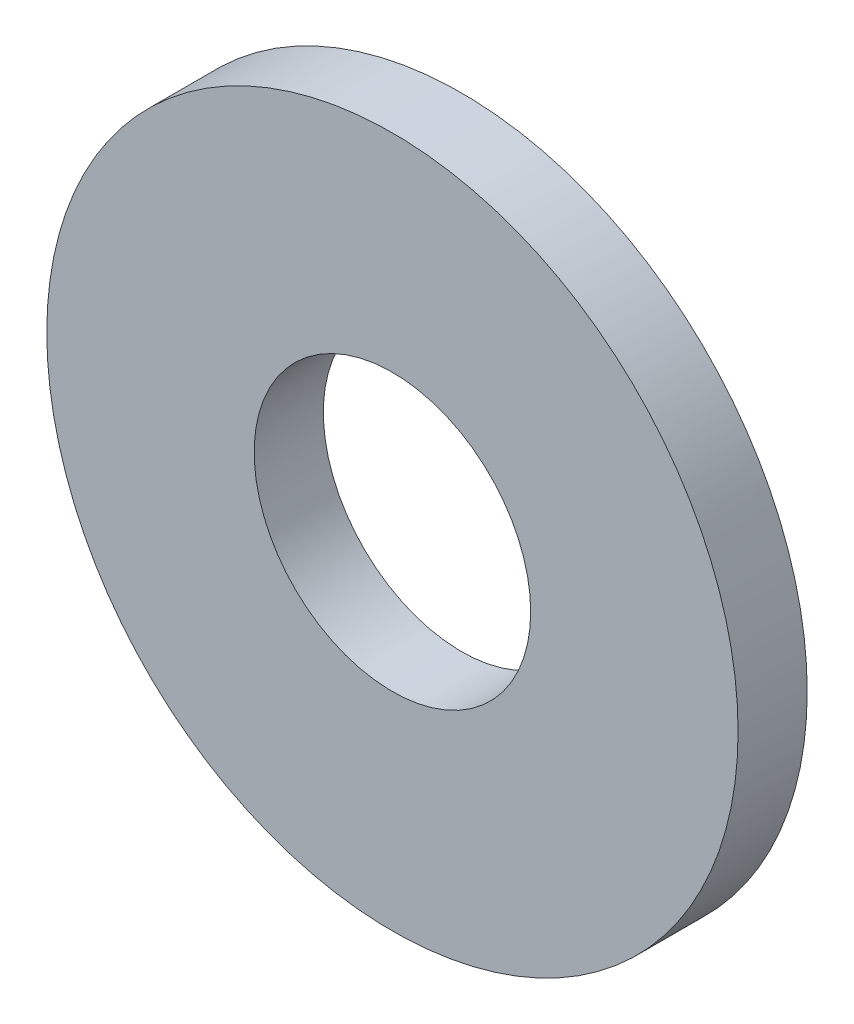
ISO-10303-21;
HEADER;
FILE_DESCRIPTION(('STEP AP214'),'2;1');
FILE_NAME('part.step','',(''),(''),'','','');
FILE_SCHEMA(('AUTOMOTIVE_DESIGN { 1 0 10303 214 1 1 1 1 }'));
ENDSEC;
DATA;
#1=APPLICATION_CONTEXT('core data for automotive mechanical design processes');
#2=APPLICATION_PROTOCOL_DEFINITION('international standard','automotive_design',2000,#1);
#3=PRODUCT_CONTEXT('',#1,'mechanical');
#4=PRODUCT('Part','Part','',(#3));
#5=PRODUCT_RELATED_PRODUCT_CATEGORY('part','',(#4));
#6=PRODUCT_DEFINITION_FORMATION('','',#4);
#7=PRODUCT_DEFINITION_CONTEXT('part definition',#1,'design');
#8=PRODUCT_DEFINITION('design','',#6,#7);
#9=PRODUCT_DEFINITION_SHAPE('','',#8);
#10=(LENGTH_UNIT() NAMED_UNIT(*) SI_UNIT(.MILLI.,.METRE.));
#11=(NAMED_UNIT(*) PLANE_ANGLE_UNIT() SI_UNIT($,.RADIAN.));
#12=(NAMED_UNIT(*) SI_UNIT($,.STERADIAN.) SOLID_ANGLE_UNIT());
#13=UNCERTAINTY_MEASURE_WITH_UNIT(LENGTH_MEASURE(1.E-05),#10,'distance_accuracy_value','');
#14=(GEOMETRIC_REPRESENTATION_CONTEXT(3) GLOBAL_UNCERTAINTY_ASSIGNED_CONTEXT((#13)) GLOBAL_UNIT_ASSIGNED_CONTEXT((#10,
#11,#12)) REPRESENTATION_CONTEXT('',''));
#15=CARTESIAN_POINT('',(0.,0.,0.));
#16=DIRECTION('',(0.,0.,1.));
#17=DIRECTION('',(1.,0.,0.));
#18=AXIS2_PLACEMENT_3D('',#15,#16,#17);
#19=CARTESIAN_POINT('',(0.,0.,0.79375));
#20=DIRECTION('',(0.,0.,1.));
#21=DIRECTION('',(1.,0.,0.));
#22=AXIS2_PLACEMENT_3D('',#19,#20,#21);
#23=PLANE('',#22);
#24=CARTESIAN_POINT('',(0.,0.,0.79375));
#25=DIRECTION('',(0.,0.,1.));
#26=DIRECTION('',(1.,0.,0.));
#27=AXIS2_PLACEMENT_3D('',#24,#25,#26);
#28=CIRCLE('',#27,7.9375);
#29=CARTESIAN_POINT('',(7.9375,0.,0.79375));
#30=VERTEX_POINT('',#29);
#31=EDGE_CURVE('E10',#30,#30,#28,.T.);
#32=ORIENTED_EDGE('',*,*,#31,.T.);
#33=EDGE_LOOP('',(#32));
#34=FACE_BOUND('',#33,.T.);
#35=CARTESIAN_POINT('',(0.,0.,0.79375));
#36=DIRECTION('',(0.,0.,1.));
#37=DIRECTION('',(1.,0.,0.));
#38=AXIS2_PLACEMENT_3D('',#35,#36,#37);
#39=CIRCLE('',#38,3.175);
#40=CARTESIAN_POINT('',(3.175,0.,0.79375));
#41=VERTEX_POINT('',#40);
#42=EDGE_CURVE('E48',#41,#41,#39,.T.);
#43=ORIENTED_EDGE('',*,*,#42,.F.);
#44=EDGE_LOOP('',(#43));
#45=FACE_BOUND('',#44,.T.);
#46=ADVANCED_FACE('F37',(#34,#45),#23,.T.);
#47=CARTESIAN_POINT('',(0.,0.,-0.79375));
#48=DIRECTION('',(0.,0.,1.));
#49=DIRECTION('',(1.,0.,0.));
#50=AXIS2_PLACEMENT_3D('',#47,#48,#49);
#51=PLANE('',#50);
#52=CARTESIAN_POINT('',(0.,0.,-0.79375));
#53=DIRECTION('',(0.,0.,1.));
#54=DIRECTION('',(1.,0.,0.));
#55=AXIS2_PLACEMENT_3D('',#52,#53,#54);
#56=CIRCLE('',#55,7.9375);
#57=CARTESIAN_POINT('',(7.9375,0.,-0.79375));
#58=VERTEX_POINT('',#57);
#59=EDGE_CURVE('E41',#58,#58,#56,.T.);
#60=ORIENTED_EDGE('',*,*,#59,.F.);
#61=EDGE_LOOP('',(#60));
#62=FACE_BOUND('',#61,.T.);
#63=CARTESIAN_POINT('',(0.,0.,-0.79375));
#64=DIRECTION('',(0.,0.,1.));
#65=DIRECTION('',(1.,0.,0.));
#66=AXIS2_PLACEMENT_3D('',#63,#64,#65);
#67=CIRCLE('',#66,3.175);
#68=CARTESIAN_POINT('',(3.175,0.,-0.79375));
#69=VERTEX_POINT('',#68);
#70=EDGE_CURVE('E50',#69,#69,#67,.T.);
#71=ORIENTED_EDGE('',*,*,#70,.T.);
#72=EDGE_LOOP('',(#71));
#73=FACE_BOUND('',#72,.T.);
#74=ADVANCED_FACE('F60',(#62,#73),#51,.F.);
#75=CARTESIAN_POINT('',(0.,0.,0.79375));
#76=DIRECTION('',(0.,0.,-1.));
#77=DIRECTION('',(-1.,0.,0.));
#78=AXIS2_PLACEMENT_3D('',#75,#76,#77);
#79=CYLINDRICAL_SURFACE('',#78,7.9375);
#80=ORIENTED_EDGE('',*,*,#31,.F.);
#81=EDGE_LOOP('',(#80));
#82=FACE_BOUND('',#81,.T.);
#83=ORIENTED_EDGE('',*,*,#59,.T.);
#84=EDGE_LOOP('',(#83));
#85=FACE_BOUND('',#84,.T.);
#86=ADVANCED_FACE('F39',(#82,#85),#79,.T.);
#87=CARTESIAN_POINT('',(0.,0.,0.79375));
#88=DIRECTION('',(0.,0.,-1.));
#89=DIRECTION('',(-1.,0.,0.));
#90=AXIS2_PLACEMENT_3D('',#87,#88,#89);
#91=CYLINDRICAL_SURFACE('',#90,3.175);
#92=ORIENTED_EDGE('',*,*,#42,.T.);
#93=EDGE_LOOP('',(#92));
#94=FACE_BOUND('',#93,.T.);
#95=ORIENTED_EDGE('',*,*,#70,.F.);
#96=EDGE_LOOP('',(#95));
#97=FACE_BOUND('',#96,.T.);
#98=ADVANCED_FACE('F56',(#94,#97),#91,.F.);
#99=CLOSED_SHELL('',(#46,#74,#86,#98));
#100=MANIFOLD_SOLID_BREP('B2',#99);
#101=ADVANCED_BREP_SHAPE_REPRESENTATION('',(#18,#100),#14);
#102=SHAPE_DEFINITION_REPRESENTATION(#9,#101);
ENDSEC;
END-ISO-10303-21;
